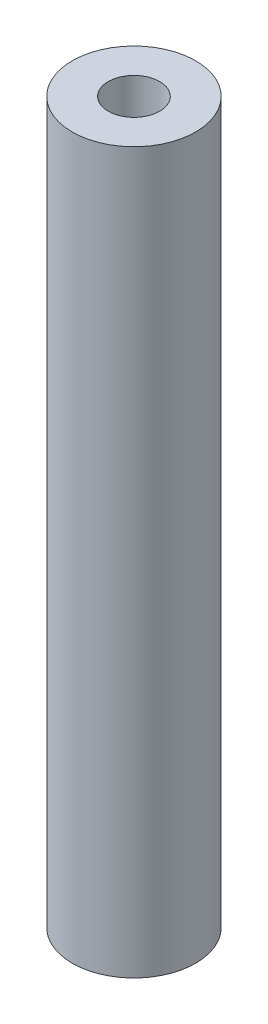
ISO-10303-21;
HEADER;
FILE_DESCRIPTION(('STEP AP214'),'2;1');
FILE_NAME('part.step','',(''),(''),'','','');
FILE_SCHEMA(('AUTOMOTIVE_DESIGN { 1 0 10303 214 1 1 1 1 }'));
ENDSEC;
DATA;
#1=APPLICATION_CONTEXT('core data for automotive mechanical design processes');
#2=APPLICATION_PROTOCOL_DEFINITION('international standard','automotive_design',2000,#1);
#3=PRODUCT_CONTEXT('',#1,'mechanical');
#4=PRODUCT('Part','Part','',(#3));
#5=PRODUCT_RELATED_PRODUCT_CATEGORY('part','',(#4));
#6=PRODUCT_DEFINITION_FORMATION('','',#4);
#7=PRODUCT_DEFINITION_CONTEXT('part definition',#1,'design');
#8=PRODUCT_DEFINITION('design','',#6,#7);
#9=PRODUCT_DEFINITION_SHAPE('','',#8);
#10=(LENGTH_UNIT() NAMED_UNIT(*) SI_UNIT(.MILLI.,.METRE.));
#11=(NAMED_UNIT(*) PLANE_ANGLE_UNIT() SI_UNIT($,.RADIAN.));
#12=(NAMED_UNIT(*) SI_UNIT($,.STERADIAN.) SOLID_ANGLE_UNIT());
#13=UNCERTAINTY_MEASURE_WITH_UNIT(LENGTH_MEASURE(1.E-05),#10,'distance_accuracy_value','');
#14=(GEOMETRIC_REPRESENTATION_CONTEXT(3) GLOBAL_UNCERTAINTY_ASSIGNED_CONTEXT((#13)) GLOBAL_UNIT_ASSIGNED_CONTEXT((#10,
#11,#12)) REPRESENTATION_CONTEXT('',''));
#15=CARTESIAN_POINT('',(0.,0.,0.));
#16=DIRECTION('',(0.,0.,1.));
#17=DIRECTION('',(1.,0.,0.));
#18=AXIS2_PLACEMENT_3D('',#15,#16,#17);
#19=CARTESIAN_POINT('',(0.,35.,0.));
#20=DIRECTION('',(0.,-1.,0.));
#21=DIRECTION('',(0.,0.,-1.));
#22=AXIS2_PLACEMENT_3D('',#19,#20,#21);
#23=CYLINDRICAL_SURFACE('',#22,3.);
#24=CARTESIAN_POINT('',(0.,35.,0.));
#25=DIRECTION('',(0.,1.,0.));
#26=DIRECTION('',(0.,0.,1.));
#27=AXIS2_PLACEMENT_3D('',#24,#25,#26);
#28=CIRCLE('',#27,3.);
#29=CARTESIAN_POINT('',(0.,35.,3.));
#30=VERTEX_POINT('',#29);
#31=EDGE_CURVE('E10',#30,#30,#28,.T.);
#32=ORIENTED_EDGE('',*,*,#31,.F.);
#33=EDGE_LOOP('',(#32));
#34=FACE_BOUND('',#33,.T.);
#35=CARTESIAN_POINT('',(0.,0.,0.));
#36=DIRECTION('',(0.,1.,0.));
#37=DIRECTION('',(0.,0.,1.));
#38=AXIS2_PLACEMENT_3D('',#35,#36,#37);
#39=CIRCLE('',#38,3.);
#40=CARTESIAN_POINT('',(0.,0.,3.));
#41=VERTEX_POINT('',#40);
#42=EDGE_CURVE('E38',#41,#41,#39,.T.);
#43=ORIENTED_EDGE('',*,*,#42,.T.);
#44=EDGE_LOOP('',(#43));
#45=FACE_BOUND('',#44,.T.);
#46=ADVANCED_FACE('F35',(#34,#45),#23,.T.);
#47=CARTESIAN_POINT('',(0.,35.,0.));
#48=DIRECTION('',(0.,1.,0.));
#49=DIRECTION('',(0.,0.,1.));
#50=AXIS2_PLACEMENT_3D('',#47,#48,#49);
#51=PLANE('',#50);
#52=CARTESIAN_POINT('',(0.,35.,0.));
#53=DIRECTION('',(0.,1.,0.));
#54=DIRECTION('',(0.,0.,1.));
#55=AXIS2_PLACEMENT_3D('',#52,#53,#54);
#56=CIRCLE('',#55,1.25);
#57=CARTESIAN_POINT('',(0.,35.,1.25));
#58=VERTEX_POINT('',#57);
#59=EDGE_CURVE('E49',#58,#58,#56,.T.);
#60=ORIENTED_EDGE('',*,*,#59,.F.);
#61=EDGE_LOOP('',(#60));
#62=FACE_BOUND('',#61,.T.);
#63=ORIENTED_EDGE('',*,*,#31,.T.);
#64=EDGE_LOOP('',(#63));
#65=FACE_BOUND('',#64,.T.);
#66=ADVANCED_FACE('F55',(#62,#65),#51,.T.);
#67=CARTESIAN_POINT('',(0.,0.,0.));
#68=DIRECTION('',(0.,1.,0.));
#69=DIRECTION('',(0.,0.,1.));
#70=AXIS2_PLACEMENT_3D('',#67,#68,#69);
#71=PLANE('',#70);
#72=CARTESIAN_POINT('',(0.,0.,0.));
#73=DIRECTION('',(0.,1.,0.));
#74=DIRECTION('',(0.,0.,1.));
#75=AXIS2_PLACEMENT_3D('',#72,#73,#74);
#76=CIRCLE('',#75,1.24999999999999);
#77=CARTESIAN_POINT('',(0.,0.,1.24999999999999));
#78=VERTEX_POINT('',#77);
#79=EDGE_CURVE('E45',#78,#78,#76,.T.);
#80=ORIENTED_EDGE('',*,*,#79,.T.);
#81=EDGE_LOOP('',(#80));
#82=FACE_BOUND('',#81,.T.);
#83=ORIENTED_EDGE('',*,*,#42,.F.);
#84=EDGE_LOOP('',(#83));
#85=FACE_BOUND('',#84,.T.);
#86=ADVANCED_FACE('F57',(#82,#85),#71,.F.);
#87=CARTESIAN_POINT('',(0.,35.,0.));
#88=DIRECTION('',(0.,1.,0.));
#89=DIRECTION('',(0.,0.,1.));
#90=AXIS2_PLACEMENT_3D('',#87,#88,#89);
#91=CYLINDRICAL_SURFACE('',#90,1.24999999999999);
#92=ORIENTED_EDGE('',*,*,#79,.F.);
#93=EDGE_LOOP('',(#92));
#94=FACE_BOUND('',#93,.T.);
#95=ORIENTED_EDGE('',*,*,#59,.T.);
#96=EDGE_LOOP('',(#95));
#97=FACE_BOUND('',#96,.T.);
#98=ADVANCED_FACE('F53',(#94,#97),#91,.F.);
#99=CLOSED_SHELL('',(#46,#66,#86,#98));
#100=MANIFOLD_SOLID_BREP('B2',#99);
#101=ADVANCED_BREP_SHAPE_REPRESENTATION('',(#18,#100),#14);
#102=SHAPE_DEFINITION_REPRESENTATION(#9,#101);
ENDSEC;
END-ISO-10303-21;
